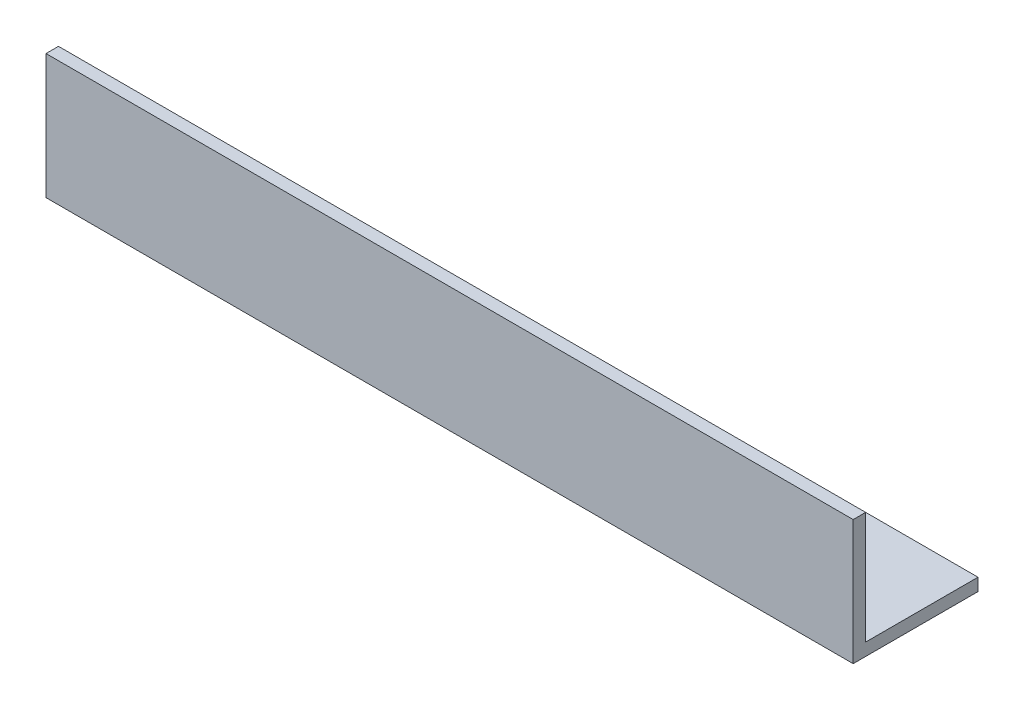
ISO-10303-21;
HEADER;
FILE_DESCRIPTION(('STEP AP214'),'2;1');
FILE_NAME('part.step','',(''),(''),'','','');
FILE_SCHEMA(('AUTOMOTIVE_DESIGN { 1 0 10303 214 1 1 1 1 }'));
ENDSEC;
DATA;
#1=APPLICATION_CONTEXT('core data for automotive mechanical design processes');
#2=APPLICATION_PROTOCOL_DEFINITION('international standard','automotive_design',2000,#1);
#3=PRODUCT_CONTEXT('',#1,'mechanical');
#4=PRODUCT('Part','Part','',(#3));
#5=PRODUCT_RELATED_PRODUCT_CATEGORY('part','',(#4));
#6=PRODUCT_DEFINITION_FORMATION('','',#4);
#7=PRODUCT_DEFINITION_CONTEXT('part definition',#1,'design');
#8=PRODUCT_DEFINITION('design','',#6,#7);
#9=PRODUCT_DEFINITION_SHAPE('','',#8);
#10=(LENGTH_UNIT() NAMED_UNIT(*) SI_UNIT(.MILLI.,.METRE.));
#11=(NAMED_UNIT(*) PLANE_ANGLE_UNIT() SI_UNIT($,.RADIAN.));
#12=(NAMED_UNIT(*) SI_UNIT($,.STERADIAN.) SOLID_ANGLE_UNIT());
#13=UNCERTAINTY_MEASURE_WITH_UNIT(LENGTH_MEASURE(1.E-05),#10,'distance_accuracy_value','');
#14=(GEOMETRIC_REPRESENTATION_CONTEXT(3) GLOBAL_UNCERTAINTY_ASSIGNED_CONTEXT((#13)) GLOBAL_UNIT_ASSIGNED_CONTEXT((#10,
#11,#12)) REPRESENTATION_CONTEXT('',''));
#15=CARTESIAN_POINT('',(0.,0.,0.));
#16=DIRECTION('',(0.,0.,1.));
#17=DIRECTION('',(1.,0.,0.));
#18=AXIS2_PLACEMENT_3D('',#15,#16,#17);
#19=CARTESIAN_POINT('',(194.,0.,0.));
#20=DIRECTION('',(0.,1.,0.));
#21=DIRECTION('',(0.,0.,1.));
#22=AXIS2_PLACEMENT_3D('',#19,#20,#21);
#23=PLANE('',#22);
#24=DIRECTION('',(0.,0.,-1.));
#25=VECTOR('',#24,1.);
#26=CARTESIAN_POINT('',(0.,0.,0.));
#27=LINE('',#26,#25);
#28=CARTESIAN_POINT('',(0.,0.,0.));
#29=VERTEX_POINT('',#28);
#30=CARTESIAN_POINT('',(0.,0.,-30.));
#31=VERTEX_POINT('',#30);
#32=EDGE_CURVE('E116',#29,#31,#27,.T.);
#33=ORIENTED_EDGE('',*,*,#32,.T.);
#34=DIRECTION('',(-1.,0.,0.));
#35=VECTOR('',#34,1.);
#36=CARTESIAN_POINT('',(194.,0.,-30.));
#37=LINE('',#36,#35);
#38=CARTESIAN_POINT('',(194.,0.,-30.));
#39=VERTEX_POINT('',#38);
#40=EDGE_CURVE('E11',#39,#31,#37,.T.);
#41=ORIENTED_EDGE('',*,*,#40,.F.);
#42=DIRECTION('',(0.,0.,-1.));
#43=VECTOR('',#42,1.);
#44=CARTESIAN_POINT('',(194.,0.,0.));
#45=LINE('',#44,#43);
#46=CARTESIAN_POINT('',(194.,0.,0.));
#47=VERTEX_POINT('',#46);
#48=EDGE_CURVE('E81',#47,#39,#45,.T.);
#49=ORIENTED_EDGE('',*,*,#48,.F.);
#50=DIRECTION('',(-1.,0.,0.));
#51=VECTOR('',#50,1.);
#52=CARTESIAN_POINT('',(194.,0.,0.));
#53=LINE('',#52,#51);
#54=EDGE_CURVE('E112',#47,#29,#53,.T.);
#55=ORIENTED_EDGE('',*,*,#54,.T.);
#56=EDGE_LOOP('',(#33,#41,#49,#55));
#57=FACE_BOUND('',#56,.T.);
#58=ADVANCED_FACE('F35',(#57),#23,.F.);
#59=CARTESIAN_POINT('',(194.,3.,-30.));
#60=DIRECTION('',(0.,0.,-1.));
#61=DIRECTION('',(-1.,0.,0.));
#62=AXIS2_PLACEMENT_3D('',#59,#60,#61);
#63=PLANE('',#62);
#64=DIRECTION('',(0.,-1.,0.));
#65=VECTOR('',#64,1.);
#66=CARTESIAN_POINT('',(0.,3.,-30.));
#67=LINE('',#66,#65);
#68=CARTESIAN_POINT('',(0.,3.,-30.));
#69=VERTEX_POINT('',#68);
#70=EDGE_CURVE('E119',#69,#31,#67,.T.);
#71=ORIENTED_EDGE('',*,*,#70,.F.);
#72=DIRECTION('',(-1.,0.,0.));
#73=VECTOR('',#72,1.);
#74=CARTESIAN_POINT('',(194.,3.,-30.));
#75=LINE('',#74,#73);
#76=CARTESIAN_POINT('',(194.,3.,-30.));
#77=VERTEX_POINT('',#76);
#78=EDGE_CURVE('E43',#77,#69,#75,.T.);
#79=ORIENTED_EDGE('',*,*,#78,.F.);
#80=DIRECTION('',(0.,-1.,0.));
#81=VECTOR('',#80,1.);
#82=CARTESIAN_POINT('',(194.,3.,-30.));
#83=LINE('',#82,#81);
#84=EDGE_CURVE('E205',#77,#39,#83,.T.);
#85=ORIENTED_EDGE('',*,*,#84,.T.);
#86=ORIENTED_EDGE('',*,*,#40,.T.);
#87=EDGE_LOOP('',(#71,#79,#85,#86));
#88=FACE_BOUND('',#87,.T.);
#89=ADVANCED_FACE('F137',(#88),#63,.T.);
#90=CARTESIAN_POINT('',(194.,3.,0.));
#91=DIRECTION('',(0.,1.,0.));
#92=DIRECTION('',(0.,0.,1.));
#93=AXIS2_PLACEMENT_3D('',#90,#91,#92);
#94=PLANE('',#93);
#95=DIRECTION('',(0.,0.,-1.));
#96=VECTOR('',#95,1.);
#97=CARTESIAN_POINT('',(0.,3.,0.));
#98=LINE('',#97,#96);
#99=CARTESIAN_POINT('',(0.,3.,-3.));
#100=VERTEX_POINT('',#99);
#101=EDGE_CURVE('E122',#100,#69,#98,.T.);
#102=ORIENTED_EDGE('',*,*,#101,.F.);
#103=DIRECTION('',(-1.,0.,0.));
#104=VECTOR('',#103,1.);
#105=CARTESIAN_POINT('',(194.,3.,-3.));
#106=LINE('',#105,#104);
#107=CARTESIAN_POINT('',(194.,3.,-3.));
#108=VERTEX_POINT('',#107);
#109=EDGE_CURVE('E102',#108,#100,#106,.T.);
#110=ORIENTED_EDGE('',*,*,#109,.F.);
#111=DIRECTION('',(0.,0.,-1.));
#112=VECTOR('',#111,1.);
#113=CARTESIAN_POINT('',(194.,3.,0.));
#114=LINE('',#113,#112);
#115=EDGE_CURVE('E108',#108,#77,#114,.T.);
#116=ORIENTED_EDGE('',*,*,#115,.T.);
#117=ORIENTED_EDGE('',*,*,#78,.T.);
#118=EDGE_LOOP('',(#102,#110,#116,#117));
#119=FACE_BOUND('',#118,.T.);
#120=ADVANCED_FACE('F134',(#119),#94,.T.);
#121=CARTESIAN_POINT('',(194.,30.,-3.));
#122=DIRECTION('',(0.,0.,-1.));
#123=DIRECTION('',(0.,1.,0.));
#124=AXIS2_PLACEMENT_3D('',#121,#122,#123);
#125=PLANE('',#124);
#126=DIRECTION('',(0.,-1.,0.));
#127=VECTOR('',#126,1.);
#128=CARTESIAN_POINT('',(0.,30.,-3.));
#129=LINE('',#128,#127);
#130=CARTESIAN_POINT('',(0.,30.,-3.));
#131=VERTEX_POINT('',#130);
#132=EDGE_CURVE('E97',#131,#100,#129,.T.);
#133=ORIENTED_EDGE('',*,*,#132,.F.);
#134=DIRECTION('',(-1.,0.,0.));
#135=VECTOR('',#134,1.);
#136=CARTESIAN_POINT('',(194.,30.,-3.));
#137=LINE('',#136,#135);
#138=CARTESIAN_POINT('',(194.,30.,-3.));
#139=VERTEX_POINT('',#138);
#140=EDGE_CURVE('E92',#139,#131,#137,.T.);
#141=ORIENTED_EDGE('',*,*,#140,.F.);
#142=DIRECTION('',(0.,-1.,0.));
#143=VECTOR('',#142,1.);
#144=CARTESIAN_POINT('',(194.,30.,-3.));
#145=LINE('',#144,#143);
#146=EDGE_CURVE('E95',#139,#108,#145,.T.);
#147=ORIENTED_EDGE('',*,*,#146,.T.);
#148=ORIENTED_EDGE('',*,*,#109,.T.);
#149=EDGE_LOOP('',(#133,#141,#147,#148));
#150=FACE_BOUND('',#149,.T.);
#151=ADVANCED_FACE('F94',(#150),#125,.T.);
#152=CARTESIAN_POINT('',(194.,30.,0.));
#153=DIRECTION('',(0.,1.,0.));
#154=DIRECTION('',(0.,0.,1.));
#155=AXIS2_PLACEMENT_3D('',#152,#153,#154);
#156=PLANE('',#155);
#157=DIRECTION('',(0.,0.,-1.));
#158=VECTOR('',#157,1.);
#159=CARTESIAN_POINT('',(0.,30.,0.));
#160=LINE('',#159,#158);
#161=CARTESIAN_POINT('',(0.,30.,0.));
#162=VERTEX_POINT('',#161);
#163=EDGE_CURVE('E126',#162,#131,#160,.T.);
#164=ORIENTED_EDGE('',*,*,#163,.F.);
#165=DIRECTION('',(-1.,0.,0.));
#166=VECTOR('',#165,1.);
#167=CARTESIAN_POINT('',(194.,30.,0.));
#168=LINE('',#167,#166);
#169=CARTESIAN_POINT('',(194.,30.,0.));
#170=VERTEX_POINT('',#169);
#171=EDGE_CURVE('E72',#170,#162,#168,.T.);
#172=ORIENTED_EDGE('',*,*,#171,.F.);
#173=DIRECTION('',(0.,0.,-1.));
#174=VECTOR('',#173,1.);
#175=CARTESIAN_POINT('',(194.,30.,0.));
#176=LINE('',#175,#174);
#177=EDGE_CURVE('E106',#170,#139,#176,.T.);
#178=ORIENTED_EDGE('',*,*,#177,.T.);
#179=ORIENTED_EDGE('',*,*,#140,.T.);
#180=EDGE_LOOP('',(#164,#172,#178,#179));
#181=FACE_BOUND('',#180,.T.);
#182=ADVANCED_FACE('F110',(#181),#156,.T.);
#183=CARTESIAN_POINT('',(194.,30.,0.));
#184=DIRECTION('',(0.,0.,-1.));
#185=DIRECTION('',(0.,1.,0.));
#186=AXIS2_PLACEMENT_3D('',#183,#184,#185);
#187=PLANE('',#186);
#188=DIRECTION('',(0.,-1.,0.));
#189=VECTOR('',#188,1.);
#190=CARTESIAN_POINT('',(0.,30.,0.));
#191=LINE('',#190,#189);
#192=EDGE_CURVE('E75',#162,#29,#191,.T.);
#193=ORIENTED_EDGE('',*,*,#192,.T.);
#194=ORIENTED_EDGE('',*,*,#54,.F.);
#195=DIRECTION('',(0.,-1.,0.));
#196=VECTOR('',#195,1.);
#197=CARTESIAN_POINT('',(194.,30.,0.));
#198=LINE('',#197,#196);
#199=EDGE_CURVE('E51',#170,#47,#198,.T.);
#200=ORIENTED_EDGE('',*,*,#199,.F.);
#201=ORIENTED_EDGE('',*,*,#171,.T.);
#202=EDGE_LOOP('',(#193,#194,#200,#201));
#203=FACE_BOUND('',#202,.T.);
#204=ADVANCED_FACE('F142',(#203),#187,.F.);
#205=CARTESIAN_POINT('',(194.,0.,0.));
#206=DIRECTION('',(-1.,0.,0.));
#207=DIRECTION('',(0.,0.,1.));
#208=AXIS2_PLACEMENT_3D('',#205,#206,#207);
#209=PLANE('',#208);
#210=ORIENTED_EDGE('',*,*,#48,.T.);
#211=ORIENTED_EDGE('',*,*,#84,.F.);
#212=ORIENTED_EDGE('',*,*,#115,.F.);
#213=ORIENTED_EDGE('',*,*,#146,.F.);
#214=ORIENTED_EDGE('',*,*,#177,.F.);
#215=ORIENTED_EDGE('',*,*,#199,.T.);
#216=EDGE_LOOP('',(#210,#211,#212,#213,#214,#215));
#217=FACE_BOUND('',#216,.T.);
#218=ADVANCED_FACE('F105',(#217),#209,.F.);
#219=CARTESIAN_POINT('',(0.,0.,0.));
#220=DIRECTION('',(-1.,0.,0.));
#221=DIRECTION('',(0.,0.,1.));
#222=AXIS2_PLACEMENT_3D('',#219,#220,#221);
#223=PLANE('',#222);
#224=ORIENTED_EDGE('',*,*,#32,.F.);
#225=ORIENTED_EDGE('',*,*,#192,.F.);
#226=ORIENTED_EDGE('',*,*,#163,.T.);
#227=ORIENTED_EDGE('',*,*,#132,.T.);
#228=ORIENTED_EDGE('',*,*,#101,.T.);
#229=ORIENTED_EDGE('',*,*,#70,.T.);
#230=EDGE_LOOP('',(#224,#225,#226,#227,#228,#229));
#231=FACE_BOUND('',#230,.T.);
#232=ADVANCED_FACE('F140',(#231),#223,.T.);
#233=CLOSED_SHELL('',(#58,#89,#120,#151,#182,#204,#218,#232));
#234=MANIFOLD_SOLID_BREP('B2',#233);
#235=ADVANCED_BREP_SHAPE_REPRESENTATION('',(#18,#234),#14);
#236=SHAPE_DEFINITION_REPRESENTATION(#9,#235);
ENDSEC;
END-ISO-10303-21;
